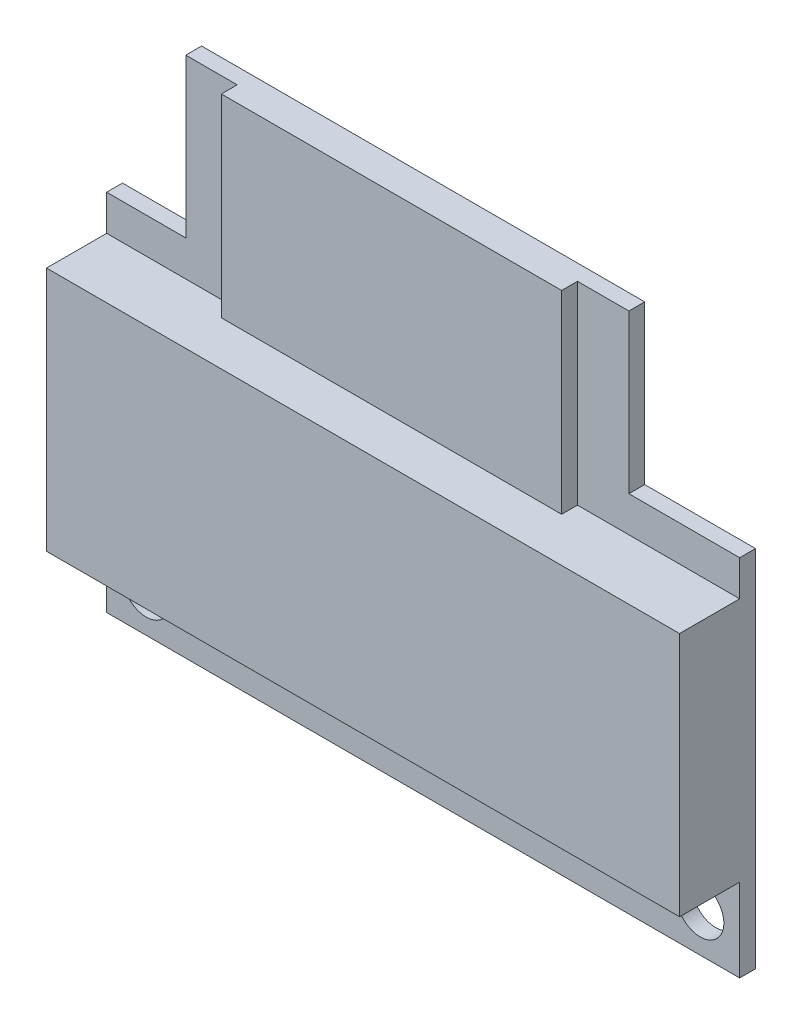
ISO-10303-21;
HEADER;
FILE_DESCRIPTION(('STEP AP214'),'2;1');
FILE_NAME('part.step','',(''),(''),'','','');
FILE_SCHEMA(('AUTOMOTIVE_DESIGN { 1 0 10303 214 1 1 1 1 }'));
ENDSEC;
DATA;
#1=APPLICATION_CONTEXT('core data for automotive mechanical design processes');
#2=APPLICATION_PROTOCOL_DEFINITION('international standard','automotive_design',2000,#1);
#3=PRODUCT_CONTEXT('',#1,'mechanical');
#4=PRODUCT('Part','Part','',(#3));
#5=PRODUCT_RELATED_PRODUCT_CATEGORY('part','',(#4));
#6=PRODUCT_DEFINITION_FORMATION('','',#4);
#7=PRODUCT_DEFINITION_CONTEXT('part definition',#1,'design');
#8=PRODUCT_DEFINITION('design','',#6,#7);
#9=PRODUCT_DEFINITION_SHAPE('','',#8);
#10=(LENGTH_UNIT() NAMED_UNIT(*) SI_UNIT(.MILLI.,.METRE.));
#11=(NAMED_UNIT(*) PLANE_ANGLE_UNIT() SI_UNIT($,.RADIAN.));
#12=(NAMED_UNIT(*) SI_UNIT($,.STERADIAN.) SOLID_ANGLE_UNIT());
#13=UNCERTAINTY_MEASURE_WITH_UNIT(LENGTH_MEASURE(1.E-05),#10,'distance_accuracy_value','');
#14=(GEOMETRIC_REPRESENTATION_CONTEXT(3) GLOBAL_UNCERTAINTY_ASSIGNED_CONTEXT((#13)) GLOBAL_UNIT_ASSIGNED_CONTEXT((#10,
#11,#12)) REPRESENTATION_CONTEXT('',''));
#15=CARTESIAN_POINT('',(0.,0.,0.));
#16=DIRECTION('',(0.,0.,1.));
#17=DIRECTION('',(1.,0.,0.));
#18=AXIS2_PLACEMENT_3D('',#15,#16,#17);
#19=CARTESIAN_POINT('',(0.,0.,2.));
#20=DIRECTION('',(0.,0.,-1.));
#21=DIRECTION('',(-1.,0.,0.));
#22=AXIS2_PLACEMENT_3D('',#19,#20,#21);
#23=PLANE('',#22);
#24=DIRECTION('',(-1.,0.,0.));
#25=VECTOR('',#24,1.);
#26=CARTESIAN_POINT('',(-88.2702560692639,13.0924856722247,2.));
#27=LINE('',#26,#25);
#28=CARTESIAN_POINT('',(-58.5202560692639,13.0924856722247,2.));
#29=VERTEX_POINT('',#28);
#30=CARTESIAN_POINT('',(-80.0202560692639,13.0924856722247,2.));
#31=VERTEX_POINT('',#30);
#32=EDGE_CURVE('E11',#29,#31,#27,.T.);
#33=ORIENTED_EDGE('',*,*,#32,.F.);
#34=DIRECTION('',(0.,1.,0.));
#35=VECTOR('',#34,1.);
#36=CARTESIAN_POINT('',(-58.5202560692639,25.3424856722248,2.));
#37=LINE('',#36,#35);
#38=CARTESIAN_POINT('',(-58.5202560692639,25.3424856722248,2.));
#39=VERTEX_POINT('',#38);
#40=EDGE_CURVE('E185',#29,#39,#37,.T.);
#41=ORIENTED_EDGE('',*,*,#40,.T.);
#42=DIRECTION('',(-1.,0.,0.));
#43=VECTOR('',#42,1.);
#44=CARTESIAN_POINT('',(-80.0202560692639,25.3424856722247,2.));
#45=LINE('',#44,#43);
#46=CARTESIAN_POINT('',(-80.0202560692639,25.3424856722247,2.));
#47=VERTEX_POINT('',#46);
#48=EDGE_CURVE('E183',#39,#47,#45,.T.);
#49=ORIENTED_EDGE('',*,*,#48,.T.);
#50=DIRECTION('',(0.,-1.,0.));
#51=VECTOR('',#50,1.);
#52=CARTESIAN_POINT('',(-80.0202560692639,13.0924856722247,2.));
#53=LINE('',#52,#51);
#54=EDGE_CURVE('E158',#47,#31,#53,.T.);
#55=ORIENTED_EDGE('',*,*,#54,.T.);
#56=EDGE_LOOP('',(#33,#41,#49,#55));
#57=FACE_BOUND('',#56,.T.);
#58=ADVANCED_FACE('F33',(#57),#23,.F.);
#59=CARTESIAN_POINT('',(0.,0.,1.));
#60=DIRECTION('',(0.,0.,-1.));
#61=DIRECTION('',(-1.,0.,0.));
#62=AXIS2_PLACEMENT_3D('',#59,#60,#61);
#63=PLANE('',#62);
#64=CARTESIAN_POINT('',(-50.7702560692639,-5.15751432777525,1.));
#65=DIRECTION('',(0.,0.,1.));
#66=DIRECTION('',(1.,0.,0.));
#67=AXIS2_PLACEMENT_3D('',#64,#65,#66);
#68=CIRCLE('',#67,1.5);
#69=CARTESIAN_POINT('',(-49.2702560692639,-5.15751432777525,1.));
#70=VERTEX_POINT('',#69);
#71=EDGE_CURVE('E407',#70,#70,#68,.T.);
#72=ORIENTED_EDGE('',*,*,#71,.F.);
#73=EDGE_LOOP('',(#72));
#74=FACE_BOUND('',#73,.T.);
#75=CARTESIAN_POINT('',(-85.7702560692639,-5.15751432777525,1.));
#76=DIRECTION('',(0.,0.,1.));
#77=DIRECTION('',(1.,0.,0.));
#78=AXIS2_PLACEMENT_3D('',#75,#76,#77);
#79=CIRCLE('',#78,1.5);
#80=CARTESIAN_POINT('',(-84.2702560692639,-5.15751432777525,1.));
#81=VERTEX_POINT('',#80);
#82=EDGE_CURVE('E177',#81,#81,#79,.T.);
#83=ORIENTED_EDGE('',*,*,#82,.F.);
#84=EDGE_LOOP('',(#83));
#85=FACE_BOUND('',#84,.T.);
#86=DIRECTION('',(1.,0.,0.));
#87=VECTOR('',#86,1.);
#88=CARTESIAN_POINT('',(-48.2702560692639,-2.40751432777526,1.));
#89=LINE('',#88,#87);
#90=CARTESIAN_POINT('',(-88.2702560692639,-2.40751432777526,1.));
#91=VERTEX_POINT('',#90);
#92=CARTESIAN_POINT('',(-48.2702560692639,-2.40751432777525,1.));
#93=VERTEX_POINT('',#92);
#94=EDGE_CURVE('E58',#91,#93,#89,.T.);
#95=ORIENTED_EDGE('',*,*,#94,.F.);
#96=DIRECTION('',(0.,-1.,0.));
#97=VECTOR('',#96,1.);
#98=CARTESIAN_POINT('',(-88.2702560692639,-7.65751432777526,1.));
#99=LINE('',#98,#97);
#100=CARTESIAN_POINT('',(-88.2702560692639,-7.65751432777526,1.));
#101=VERTEX_POINT('',#100);
#102=EDGE_CURVE('E155',#91,#101,#99,.T.);
#103=ORIENTED_EDGE('',*,*,#102,.T.);
#104=DIRECTION('',(1.,0.,0.));
#105=VECTOR('',#104,1.);
#106=CARTESIAN_POINT('',(-48.2702560692639,-7.65751432777526,1.));
#107=LINE('',#106,#105);
#108=CARTESIAN_POINT('',(-48.2702560692639,-7.65751432777526,1.));
#109=VERTEX_POINT('',#108);
#110=EDGE_CURVE('E203',#101,#109,#107,.T.);
#111=ORIENTED_EDGE('',*,*,#110,.T.);
#112=DIRECTION('',(0.,1.,0.));
#113=VECTOR('',#112,1.);
#114=CARTESIAN_POINT('',(-48.2702560692639,15.3424856722247,1.));
#115=LINE('',#114,#113);
#116=EDGE_CURVE('E216',#109,#93,#115,.T.);
#117=ORIENTED_EDGE('',*,*,#116,.T.);
#118=EDGE_LOOP('',(#95,#103,#111,#117));
#119=FACE_BOUND('',#118,.T.);
#120=ADVANCED_FACE('F349',(#74,#85,#119),#63,.F.);
#121=DIRECTION('',(-1.,0.,0.));
#122=VECTOR('',#121,1.);
#123=CARTESIAN_POINT('',(-88.2702560692639,13.0924856722247,1.));
#124=LINE('',#123,#122);
#125=CARTESIAN_POINT('',(-80.0202560692639,13.0924856722247,1.));
#126=VERTEX_POINT('',#125);
#127=CARTESIAN_POINT('',(-88.2702560692639,13.0924856722247,1.));
#128=VERTEX_POINT('',#127);
#129=EDGE_CURVE('E50',#126,#128,#124,.T.);
#130=ORIENTED_EDGE('',*,*,#129,.F.);
#131=DIRECTION('',(0.,-1.,0.));
#132=VECTOR('',#131,1.);
#133=CARTESIAN_POINT('',(-80.0202560692639,13.0924856722247,1.));
#134=LINE('',#133,#132);
#135=CARTESIAN_POINT('',(-80.0202560692639,25.3424856722247,1.));
#136=VERTEX_POINT('',#135);
#137=EDGE_CURVE('E199',#136,#126,#134,.T.);
#138=ORIENTED_EDGE('',*,*,#137,.F.);
#139=DIRECTION('',(-1.,0.,0.));
#140=VECTOR('',#139,1.);
#141=CARTESIAN_POINT('',(-83.2702560692639,25.3424856722247,1.));
#142=LINE('',#141,#140);
#143=CARTESIAN_POINT('',(-83.2702560692639,25.3424856722247,1.));
#144=VERTEX_POINT('',#143);
#145=EDGE_CURVE('E267',#136,#144,#142,.T.);
#146=ORIENTED_EDGE('',*,*,#145,.T.);
#147=DIRECTION('',(0.,-1.,0.));
#148=VECTOR('',#147,1.);
#149=CARTESIAN_POINT('',(-83.2702560692639,15.3424856722247,1.));
#150=LINE('',#149,#148);
#151=CARTESIAN_POINT('',(-83.2702560692639,15.3424856722247,1.));
#152=VERTEX_POINT('',#151);
#153=EDGE_CURVE('E272',#144,#152,#150,.T.);
#154=ORIENTED_EDGE('',*,*,#153,.T.);
#155=DIRECTION('',(-1.,0.,0.));
#156=VECTOR('',#155,1.);
#157=CARTESIAN_POINT('',(-88.2702560692639,15.3424856722247,1.));
#158=LINE('',#157,#156);
#159=CARTESIAN_POINT('',(-88.2702560692639,15.3424856722247,1.));
#160=VERTEX_POINT('',#159);
#161=EDGE_CURVE('E260',#152,#160,#158,.T.);
#162=ORIENTED_EDGE('',*,*,#161,.T.);
#163=EDGE_CURVE('E241',#160,#128,#99,.T.);
#164=ORIENTED_EDGE('',*,*,#163,.T.);
#165=EDGE_LOOP('',(#130,#138,#146,#154,#162,#164));
#166=FACE_BOUND('',#165,.T.);
#167=ADVANCED_FACE('F336',(#166),#63,.F.);
#168=DIRECTION('',(0.,1.,0.));
#169=VECTOR('',#168,1.);
#170=CARTESIAN_POINT('',(-58.5202560692639,25.3424856722248,1.));
#171=LINE('',#170,#169);
#172=CARTESIAN_POINT('',(-58.5202560692639,13.0924856722247,1.));
#173=VERTEX_POINT('',#172);
#174=CARTESIAN_POINT('',(-58.5202560692639,25.3424856722247,1.));
#175=VERTEX_POINT('',#174);
#176=EDGE_CURVE('E280',#173,#175,#171,.T.);
#177=ORIENTED_EDGE('',*,*,#176,.F.);
#178=DIRECTION('',(-1.,0.,0.));
#179=VECTOR('',#178,1.);
#180=CARTESIAN_POINT('',(-58.5202560692639,13.0924856722247,1.));
#181=LINE('',#180,#179);
#182=CARTESIAN_POINT('',(-48.2702560692639,13.0924856722247,1.));
#183=VERTEX_POINT('',#182);
#184=EDGE_CURVE('E192',#183,#173,#181,.T.);
#185=ORIENTED_EDGE('',*,*,#184,.F.);
#186=CARTESIAN_POINT('',(-48.2702560692639,15.3424856722247,1.));
#187=VERTEX_POINT('',#186);
#188=EDGE_CURVE('E206',#183,#187,#115,.T.);
#189=ORIENTED_EDGE('',*,*,#188,.T.);
#190=DIRECTION('',(-1.,0.,0.));
#191=VECTOR('',#190,1.);
#192=CARTESIAN_POINT('',(-55.2702560692639,15.3424856722247,1.));
#193=LINE('',#192,#191);
#194=CARTESIAN_POINT('',(-55.2702560692639,15.3424856722247,1.));
#195=VERTEX_POINT('',#194);
#196=EDGE_CURVE('E210',#187,#195,#193,.T.);
#197=ORIENTED_EDGE('',*,*,#196,.T.);
#198=DIRECTION('',(0.,1.,0.));
#199=VECTOR('',#198,1.);
#200=CARTESIAN_POINT('',(-55.2702560692639,25.3424856722247,1.));
#201=LINE('',#200,#199);
#202=CARTESIAN_POINT('',(-55.2702560692639,25.3424856722247,1.));
#203=VERTEX_POINT('',#202);
#204=EDGE_CURVE('E270',#195,#203,#201,.T.);
#205=ORIENTED_EDGE('',*,*,#204,.T.);
#206=EDGE_CURVE('E269',#203,#175,#142,.T.);
#207=ORIENTED_EDGE('',*,*,#206,.T.);
#208=EDGE_LOOP('',(#177,#185,#189,#197,#205,#207));
#209=FACE_BOUND('',#208,.T.);
#210=ADVANCED_FACE('F279',(#209),#63,.F.);
#211=CARTESIAN_POINT('',(-48.2702560692639,-7.65751432777526,1.));
#212=DIRECTION('',(0.,1.,0.));
#213=DIRECTION('',(0.,0.,1.));
#214=AXIS2_PLACEMENT_3D('',#211,#212,#213);
#215=PLANE('',#214);
#216=DIRECTION('',(1.,0.,0.));
#217=VECTOR('',#216,1.);
#218=CARTESIAN_POINT('',(-48.2702560692639,-7.65751432777526,0.));
#219=LINE('',#218,#217);
#220=CARTESIAN_POINT('',(-88.2702560692639,-7.65751432777526,0.));
#221=VERTEX_POINT('',#220);
#222=CARTESIAN_POINT('',(-48.2702560692639,-7.65751432777526,0.));
#223=VERTEX_POINT('',#222);
#224=EDGE_CURVE('E255',#221,#223,#219,.T.);
#225=ORIENTED_EDGE('',*,*,#224,.T.);
#226=DIRECTION('',(0.,0.,-1.));
#227=VECTOR('',#226,1.);
#228=CARTESIAN_POINT('',(-48.2702560692639,-7.65751432777526,1.));
#229=LINE('',#228,#227);
#230=EDGE_CURVE('E42',#109,#223,#229,.T.);
#231=ORIENTED_EDGE('',*,*,#230,.F.);
#232=ORIENTED_EDGE('',*,*,#110,.F.);
#233=DIRECTION('',(0.,0.,-1.));
#234=VECTOR('',#233,1.);
#235=CARTESIAN_POINT('',(-88.2702560692639,-7.65751432777526,1.));
#236=LINE('',#235,#234);
#237=EDGE_CURVE('E238',#101,#221,#236,.T.);
#238=ORIENTED_EDGE('',*,*,#237,.T.);
#239=EDGE_LOOP('',(#225,#231,#232,#238));
#240=FACE_BOUND('',#239,.T.);
#241=ADVANCED_FACE('F35',(#240),#215,.F.);
#242=CARTESIAN_POINT('',(-48.2702560692639,15.3424856722247,1.));
#243=DIRECTION('',(-1.,0.,0.));
#244=DIRECTION('',(0.,0.,1.));
#245=AXIS2_PLACEMENT_3D('',#242,#243,#244);
#246=PLANE('',#245);
#247=DIRECTION('',(0.,1.,0.));
#248=VECTOR('',#247,1.);
#249=CARTESIAN_POINT('',(-48.2702560692639,15.3424856722247,0.));
#250=LINE('',#249,#248);
#251=CARTESIAN_POINT('',(-48.2702560692639,15.3424856722247,0.));
#252=VERTEX_POINT('',#251);
#253=EDGE_CURVE('E253',#223,#252,#250,.T.);
#254=ORIENTED_EDGE('',*,*,#253,.T.);
#255=DIRECTION('',(0.,0.,-1.));
#256=VECTOR('',#255,1.);
#257=CARTESIAN_POINT('',(-48.2702560692639,15.3424856722247,1.));
#258=LINE('',#257,#256);
#259=EDGE_CURVE('E220',#187,#252,#258,.T.);
#260=ORIENTED_EDGE('',*,*,#259,.F.);
#261=ORIENTED_EDGE('',*,*,#188,.F.);
#262=DIRECTION('',(0.,0.,-1.));
#263=VECTOR('',#262,1.);
#264=CARTESIAN_POINT('',(-48.2702560692639,13.0924856722247,2.));
#265=LINE('',#264,#263);
#266=CARTESIAN_POINT('',(-48.2702560692639,13.0924856722247,4.8));
#267=VERTEX_POINT('',#266);
#268=EDGE_CURVE('E300',#267,#183,#265,.T.);
#269=ORIENTED_EDGE('',*,*,#268,.F.);
#270=DIRECTION('',(0.,1.,0.));
#271=VECTOR('',#270,1.);
#272=CARTESIAN_POINT('',(-48.2702560692639,13.0924856722247,4.8));
#273=LINE('',#272,#271);
#274=CARTESIAN_POINT('',(-48.2702560692639,-2.40751432777526,4.8));
#275=VERTEX_POINT('',#274);
#276=EDGE_CURVE('E168',#275,#267,#273,.T.);
#277=ORIENTED_EDGE('',*,*,#276,.F.);
#278=DIRECTION('',(0.,0.,-1.));
#279=VECTOR('',#278,1.);
#280=CARTESIAN_POINT('',(-48.2702560692639,-2.40751432777526,2.));
#281=LINE('',#280,#279);
#282=EDGE_CURVE('E164',#275,#93,#281,.T.);
#283=ORIENTED_EDGE('',*,*,#282,.T.);
#284=ORIENTED_EDGE('',*,*,#116,.F.);
#285=ORIENTED_EDGE('',*,*,#230,.T.);
#286=EDGE_LOOP('',(#254,#260,#261,#269,#277,#283,#284,#285));
#287=FACE_BOUND('',#286,.T.);
#288=ADVANCED_FACE('F332',(#287),#246,.F.);
#289=CARTESIAN_POINT('',(-55.2702560692639,15.3424856722247,1.));
#290=DIRECTION('',(0.,-1.,0.));
#291=DIRECTION('',(0.,0.,-1.));
#292=AXIS2_PLACEMENT_3D('',#289,#290,#291);
#293=PLANE('',#292);
#294=DIRECTION('',(-1.,0.,0.));
#295=VECTOR('',#294,1.);
#296=CARTESIAN_POINT('',(-55.2702560692639,15.3424856722247,0.));
#297=LINE('',#296,#295);
#298=CARTESIAN_POINT('',(-55.2702560692639,15.3424856722247,0.));
#299=VERTEX_POINT('',#298);
#300=EDGE_CURVE('E251',#252,#299,#297,.T.);
#301=ORIENTED_EDGE('',*,*,#300,.T.);
#302=DIRECTION('',(0.,0.,-1.));
#303=VECTOR('',#302,1.);
#304=CARTESIAN_POINT('',(-55.2702560692639,15.3424856722247,1.));
#305=LINE('',#304,#303);
#306=EDGE_CURVE('E223',#195,#299,#305,.T.);
#307=ORIENTED_EDGE('',*,*,#306,.F.);
#308=ORIENTED_EDGE('',*,*,#196,.F.);
#309=ORIENTED_EDGE('',*,*,#259,.T.);
#310=EDGE_LOOP('',(#301,#307,#308,#309));
#311=FACE_BOUND('',#310,.T.);
#312=ADVANCED_FACE('F369',(#311),#293,.F.);
#313=CARTESIAN_POINT('',(-55.2702560692639,25.3424856722247,1.));
#314=DIRECTION('',(-1.,0.,0.));
#315=DIRECTION('',(0.,0.,1.));
#316=AXIS2_PLACEMENT_3D('',#313,#314,#315);
#317=PLANE('',#316);
#318=DIRECTION('',(0.,1.,0.));
#319=VECTOR('',#318,1.);
#320=CARTESIAN_POINT('',(-55.2702560692639,25.3424856722247,0.));
#321=LINE('',#320,#319);
#322=CARTESIAN_POINT('',(-55.2702560692639,25.3424856722247,0.));
#323=VERTEX_POINT('',#322);
#324=EDGE_CURVE('E249',#299,#323,#321,.T.);
#325=ORIENTED_EDGE('',*,*,#324,.T.);
#326=DIRECTION('',(0.,0.,-1.));
#327=VECTOR('',#326,1.);
#328=CARTESIAN_POINT('',(-55.2702560692639,25.3424856722247,1.));
#329=LINE('',#328,#327);
#330=EDGE_CURVE('E226',#203,#323,#329,.T.);
#331=ORIENTED_EDGE('',*,*,#330,.F.);
#332=ORIENTED_EDGE('',*,*,#204,.F.);
#333=ORIENTED_EDGE('',*,*,#306,.T.);
#334=EDGE_LOOP('',(#325,#331,#332,#333));
#335=FACE_BOUND('',#334,.T.);
#336=ADVANCED_FACE('F373',(#335),#317,.F.);
#337=CARTESIAN_POINT('',(-83.2702560692639,25.3424856722247,1.));
#338=DIRECTION('',(0.,-1.,0.));
#339=DIRECTION('',(0.,0.,-1.));
#340=AXIS2_PLACEMENT_3D('',#337,#338,#339);
#341=PLANE('',#340);
#342=DIRECTION('',(-1.,0.,0.));
#343=VECTOR('',#342,1.);
#344=CARTESIAN_POINT('',(-83.2702560692639,25.3424856722247,0.));
#345=LINE('',#344,#343);
#346=CARTESIAN_POINT('',(-83.2702560692639,25.3424856722247,0.));
#347=VERTEX_POINT('',#346);
#348=EDGE_CURVE('E247',#323,#347,#345,.T.);
#349=ORIENTED_EDGE('',*,*,#348,.T.);
#350=DIRECTION('',(0.,0.,-1.));
#351=VECTOR('',#350,1.);
#352=CARTESIAN_POINT('',(-83.2702560692639,25.3424856722247,1.));
#353=LINE('',#352,#351);
#354=EDGE_CURVE('E229',#144,#347,#353,.T.);
#355=ORIENTED_EDGE('',*,*,#354,.F.);
#356=ORIENTED_EDGE('',*,*,#145,.F.);
#357=DIRECTION('',(0.,0.,-1.));
#358=VECTOR('',#357,1.);
#359=CARTESIAN_POINT('',(-80.0202560692639,25.3424856722247,2.));
#360=LINE('',#359,#358);
#361=EDGE_CURVE('E298',#47,#136,#360,.T.);
#362=ORIENTED_EDGE('',*,*,#361,.F.);
#363=ORIENTED_EDGE('',*,*,#48,.F.);
#364=DIRECTION('',(0.,0.,-1.));
#365=VECTOR('',#364,1.);
#366=CARTESIAN_POINT('',(-58.5202560692639,25.3424856722248,2.));
#367=LINE('',#366,#365);
#368=EDGE_CURVE('E291',#39,#175,#367,.T.);
#369=ORIENTED_EDGE('',*,*,#368,.T.);
#370=ORIENTED_EDGE('',*,*,#206,.F.);
#371=ORIENTED_EDGE('',*,*,#330,.T.);
#372=EDGE_LOOP('',(#349,#355,#356,#362,#363,#369,#370,#371));
#373=FACE_BOUND('',#372,.T.);
#374=ADVANCED_FACE('F296',(#373),#341,.F.);
#375=CARTESIAN_POINT('',(-83.2702560692639,15.3424856722247,1.));
#376=DIRECTION('',(1.,0.,0.));
#377=DIRECTION('',(0.,0.,-1.));
#378=AXIS2_PLACEMENT_3D('',#375,#376,#377);
#379=PLANE('',#378);
#380=DIRECTION('',(0.,-1.,0.));
#381=VECTOR('',#380,1.);
#382=CARTESIAN_POINT('',(-83.2702560692639,15.3424856722247,0.));
#383=LINE('',#382,#381);
#384=CARTESIAN_POINT('',(-83.2702560692639,15.3424856722247,0.));
#385=VERTEX_POINT('',#384);
#386=EDGE_CURVE('E245',#347,#385,#383,.T.);
#387=ORIENTED_EDGE('',*,*,#386,.T.);
#388=DIRECTION('',(0.,0.,-1.));
#389=VECTOR('',#388,1.);
#390=CARTESIAN_POINT('',(-83.2702560692639,15.3424856722247,1.));
#391=LINE('',#390,#389);
#392=EDGE_CURVE('E232',#152,#385,#391,.T.);
#393=ORIENTED_EDGE('',*,*,#392,.F.);
#394=ORIENTED_EDGE('',*,*,#153,.F.);
#395=ORIENTED_EDGE('',*,*,#354,.T.);
#396=EDGE_LOOP('',(#387,#393,#394,#395));
#397=FACE_BOUND('',#396,.T.);
#398=ADVANCED_FACE('F382',(#397),#379,.F.);
#399=CARTESIAN_POINT('',(-88.2702560692639,15.3424856722247,1.));
#400=DIRECTION('',(0.,-1.,0.));
#401=DIRECTION('',(0.,0.,-1.));
#402=AXIS2_PLACEMENT_3D('',#399,#400,#401);
#403=PLANE('',#402);
#404=DIRECTION('',(-1.,0.,0.));
#405=VECTOR('',#404,1.);
#406=CARTESIAN_POINT('',(-88.2702560692639,15.3424856722247,0.));
#407=LINE('',#406,#405);
#408=CARTESIAN_POINT('',(-88.2702560692639,15.3424856722247,0.));
#409=VERTEX_POINT('',#408);
#410=EDGE_CURVE('E243',#385,#409,#407,.T.);
#411=ORIENTED_EDGE('',*,*,#410,.T.);
#412=DIRECTION('',(0.,0.,-1.));
#413=VECTOR('',#412,1.);
#414=CARTESIAN_POINT('',(-88.2702560692639,15.3424856722247,1.));
#415=LINE('',#414,#413);
#416=EDGE_CURVE('E235',#160,#409,#415,.T.);
#417=ORIENTED_EDGE('',*,*,#416,.F.);
#418=ORIENTED_EDGE('',*,*,#161,.F.);
#419=ORIENTED_EDGE('',*,*,#392,.T.);
#420=EDGE_LOOP('',(#411,#417,#418,#419));
#421=FACE_BOUND('',#420,.T.);
#422=ADVANCED_FACE('F339',(#421),#403,.F.);
#423=CARTESIAN_POINT('',(-88.2702560692639,-7.65751432777526,1.));
#424=DIRECTION('',(1.,0.,0.));
#425=DIRECTION('',(0.,0.,-1.));
#426=AXIS2_PLACEMENT_3D('',#423,#424,#425);
#427=PLANE('',#426);
#428=DIRECTION('',(0.,-1.,0.));
#429=VECTOR('',#428,1.);
#430=CARTESIAN_POINT('',(-88.2702560692639,-7.65751432777526,0.));
#431=LINE('',#430,#429);
#432=EDGE_CURVE('E207',#409,#221,#431,.T.);
#433=ORIENTED_EDGE('',*,*,#432,.T.);
#434=ORIENTED_EDGE('',*,*,#237,.F.);
#435=ORIENTED_EDGE('',*,*,#102,.F.);
#436=DIRECTION('',(0.,0.,-1.));
#437=VECTOR('',#436,1.);
#438=CARTESIAN_POINT('',(-88.2702560692639,-2.40751432777526,2.));
#439=LINE('',#438,#437);
#440=CARTESIAN_POINT('',(-88.2702560692639,-2.40751432777526,4.8));
#441=VERTEX_POINT('',#440);
#442=EDGE_CURVE('E148',#441,#91,#439,.T.);
#443=ORIENTED_EDGE('',*,*,#442,.F.);
#444=DIRECTION('',(0.,-1.,0.));
#445=VECTOR('',#444,1.);
#446=CARTESIAN_POINT('',(-88.2702560692639,13.0924856722247,4.8));
#447=LINE('',#446,#445);
#448=CARTESIAN_POINT('',(-88.2702560692639,13.0924856722247,4.8));
#449=VERTEX_POINT('',#448);
#450=EDGE_CURVE('E153',#449,#441,#447,.T.);
#451=ORIENTED_EDGE('',*,*,#450,.F.);
#452=DIRECTION('',(0.,0.,-1.));
#453=VECTOR('',#452,1.);
#454=CARTESIAN_POINT('',(-88.2702560692639,13.0924856722247,2.));
#455=LINE('',#454,#453);
#456=EDGE_CURVE('E157',#449,#128,#455,.T.);
#457=ORIENTED_EDGE('',*,*,#456,.T.);
#458=ORIENTED_EDGE('',*,*,#163,.F.);
#459=ORIENTED_EDGE('',*,*,#416,.T.);
#460=EDGE_LOOP('',(#433,#434,#435,#443,#451,#457,#458,#459));
#461=FACE_BOUND('',#460,.T.);
#462=ADVANCED_FACE('F150',(#461),#427,.F.);
#463=CARTESIAN_POINT('',(0.,0.,0.));
#464=DIRECTION('',(0.,0.,-1.));
#465=DIRECTION('',(-1.,0.,0.));
#466=AXIS2_PLACEMENT_3D('',#463,#464,#465);
#467=PLANE('',#466);
#468=CARTESIAN_POINT('',(-50.7702560692639,-5.15751432777525,0.));
#469=DIRECTION('',(0.,0.,1.));
#470=DIRECTION('',(1.,0.,0.));
#471=AXIS2_PLACEMENT_3D('',#468,#469,#470);
#472=CIRCLE('',#471,1.5);
#473=CARTESIAN_POINT('',(-49.2702560692639,-5.15751432777525,0.));
#474=VERTEX_POINT('',#473);
#475=EDGE_CURVE('E397',#474,#474,#472,.T.);
#476=ORIENTED_EDGE('',*,*,#475,.T.);
#477=EDGE_LOOP('',(#476));
#478=FACE_BOUND('',#477,.T.);
#479=CARTESIAN_POINT('',(-85.7702560692639,-5.15751432777525,0.));
#480=DIRECTION('',(0.,0.,1.));
#481=DIRECTION('',(1.,0.,0.));
#482=AXIS2_PLACEMENT_3D('',#479,#480,#481);
#483=CIRCLE('',#482,1.5);
#484=CARTESIAN_POINT('',(-84.2702560692639,-5.15751432777525,0.));
#485=VERTEX_POINT('',#484);
#486=EDGE_CURVE('E174',#485,#485,#483,.T.);
#487=ORIENTED_EDGE('',*,*,#486,.T.);
#488=EDGE_LOOP('',(#487));
#489=FACE_BOUND('',#488,.T.);
#490=ORIENTED_EDGE('',*,*,#224,.F.);
#491=ORIENTED_EDGE('',*,*,#432,.F.);
#492=ORIENTED_EDGE('',*,*,#410,.F.);
#493=ORIENTED_EDGE('',*,*,#386,.F.);
#494=ORIENTED_EDGE('',*,*,#348,.F.);
#495=ORIENTED_EDGE('',*,*,#324,.F.);
#496=ORIENTED_EDGE('',*,*,#300,.F.);
#497=ORIENTED_EDGE('',*,*,#253,.F.);
#498=EDGE_LOOP('',(#490,#491,#492,#493,#494,#495,#496,#497));
#499=FACE_BOUND('',#498,.T.);
#500=ADVANCED_FACE('F344',(#478,#489,#499),#467,.T.);
#501=CARTESIAN_POINT('',(-48.2702560692639,-2.40751432777526,2.));
#502=DIRECTION('',(0.,1.,0.));
#503=DIRECTION('',(0.,0.,1.));
#504=AXIS2_PLACEMENT_3D('',#501,#502,#503);
#505=PLANE('',#504);
#506=ORIENTED_EDGE('',*,*,#94,.T.);
#507=ORIENTED_EDGE('',*,*,#282,.F.);
#508=DIRECTION('',(1.,0.,0.));
#509=VECTOR('',#508,1.);
#510=CARTESIAN_POINT('',(-88.2702560692639,-2.40751432777526,4.8));
#511=LINE('',#510,#509);
#512=EDGE_CURVE('E161',#441,#275,#511,.T.);
#513=ORIENTED_EDGE('',*,*,#512,.F.);
#514=ORIENTED_EDGE('',*,*,#442,.T.);
#515=EDGE_LOOP('',(#506,#507,#513,#514));
#516=FACE_BOUND('',#515,.T.);
#517=ADVANCED_FACE('F162',(#516),#505,.F.);
#518=CARTESIAN_POINT('',(-58.5202560692639,13.0924856722247,2.));
#519=DIRECTION('',(0.,-1.,0.));
#520=DIRECTION('',(0.,0.,-1.));
#521=AXIS2_PLACEMENT_3D('',#518,#519,#520);
#522=PLANE('',#521);
#523=ORIENTED_EDGE('',*,*,#184,.T.);
#524=DIRECTION('',(0.,0.,-1.));
#525=VECTOR('',#524,1.);
#526=CARTESIAN_POINT('',(-58.5202560692639,13.0924856722247,2.));
#527=LINE('',#526,#525);
#528=EDGE_CURVE('E294',#29,#173,#527,.T.);
#529=ORIENTED_EDGE('',*,*,#528,.F.);
#530=ORIENTED_EDGE('',*,*,#32,.T.);
#531=DIRECTION('',(0.,0.,-1.));
#532=VECTOR('',#531,1.);
#533=CARTESIAN_POINT('',(-80.0202560692639,13.0924856722247,2.));
#534=LINE('',#533,#532);
#535=EDGE_CURVE('E303',#31,#126,#534,.T.);
#536=ORIENTED_EDGE('',*,*,#535,.T.);
#537=ORIENTED_EDGE('',*,*,#129,.T.);
#538=ORIENTED_EDGE('',*,*,#456,.F.);
#539=DIRECTION('',(-1.,0.,0.));
#540=VECTOR('',#539,1.);
#541=CARTESIAN_POINT('',(-88.2702560692639,13.0924856722247,4.8));
#542=LINE('',#541,#540);
#543=EDGE_CURVE('E173',#267,#449,#542,.T.);
#544=ORIENTED_EDGE('',*,*,#543,.F.);
#545=ORIENTED_EDGE('',*,*,#268,.T.);
#546=EDGE_LOOP('',(#523,#529,#530,#536,#537,#538,#544,#545));
#547=FACE_BOUND('',#546,.T.);
#548=ADVANCED_FACE('F323',(#547),#522,.F.);
#549=CARTESIAN_POINT('',(-58.5202560692639,25.3424856722248,2.));
#550=DIRECTION('',(-1.,0.,0.));
#551=DIRECTION('',(0.,0.,1.));
#552=AXIS2_PLACEMENT_3D('',#549,#550,#551);
#553=PLANE('',#552);
#554=ORIENTED_EDGE('',*,*,#176,.T.);
#555=ORIENTED_EDGE('',*,*,#368,.F.);
#556=ORIENTED_EDGE('',*,*,#40,.F.);
#557=ORIENTED_EDGE('',*,*,#528,.T.);
#558=EDGE_LOOP('',(#554,#555,#556,#557));
#559=FACE_BOUND('',#558,.T.);
#560=ADVANCED_FACE('F289',(#559),#553,.F.);
#561=CARTESIAN_POINT('',(-80.0202560692639,13.0924856722247,2.));
#562=DIRECTION('',(1.,0.,0.));
#563=DIRECTION('',(0.,0.,-1.));
#564=AXIS2_PLACEMENT_3D('',#561,#562,#563);
#565=PLANE('',#564);
#566=ORIENTED_EDGE('',*,*,#137,.T.);
#567=ORIENTED_EDGE('',*,*,#535,.F.);
#568=ORIENTED_EDGE('',*,*,#54,.F.);
#569=ORIENTED_EDGE('',*,*,#361,.T.);
#570=EDGE_LOOP('',(#566,#567,#568,#569));
#571=FACE_BOUND('',#570,.T.);
#572=ADVANCED_FACE('F419',(#571),#565,.F.);
#573=CARTESIAN_POINT('',(0.,0.,4.8));
#574=DIRECTION('',(0.,0.,1.));
#575=DIRECTION('',(1.,0.,0.));
#576=AXIS2_PLACEMENT_3D('',#573,#574,#575);
#577=PLANE('',#576);
#578=ORIENTED_EDGE('',*,*,#450,.T.);
#579=ORIENTED_EDGE('',*,*,#512,.T.);
#580=ORIENTED_EDGE('',*,*,#276,.T.);
#581=ORIENTED_EDGE('',*,*,#543,.T.);
#582=EDGE_LOOP('',(#578,#579,#580,#581));
#583=FACE_BOUND('',#582,.T.);
#584=ADVANCED_FACE('F171',(#583),#577,.T.);
#585=CARTESIAN_POINT('',(-85.7702560692639,-5.15751432777525,0.));
#586=DIRECTION('',(0.,0.,1.));
#587=DIRECTION('',(1.,0.,0.));
#588=AXIS2_PLACEMENT_3D('',#585,#586,#587);
#589=CYLINDRICAL_SURFACE('',#588,1.5);
#590=ORIENTED_EDGE('',*,*,#486,.F.);
#591=EDGE_LOOP('',(#590));
#592=FACE_BOUND('',#591,.T.);
#593=ORIENTED_EDGE('',*,*,#82,.T.);
#594=EDGE_LOOP('',(#593));
#595=FACE_BOUND('',#594,.T.);
#596=ADVANCED_FACE('F400',(#592,#595),#589,.F.);
#597=CARTESIAN_POINT('',(-50.7702560692639,-5.15751432777525,0.));
#598=DIRECTION('',(0.,0.,1.));
#599=DIRECTION('',(1.,0.,0.));
#600=AXIS2_PLACEMENT_3D('',#597,#598,#599);
#601=CYLINDRICAL_SURFACE('',#600,1.5);
#602=ORIENTED_EDGE('',*,*,#475,.F.);
#603=EDGE_LOOP('',(#602));
#604=FACE_BOUND('',#603,.T.);
#605=ORIENTED_EDGE('',*,*,#71,.T.);
#606=EDGE_LOOP('',(#605));
#607=FACE_BOUND('',#606,.T.);
#608=ADVANCED_FACE('F403',(#604,#607),#601,.F.);
#609=CLOSED_SHELL('',(#58,#120,#167,#210,#241,#288,#312,#336,#374,#398,#422,#462,#500,#517,#548,
#560,#572,#584,#596,#608));
#610=MANIFOLD_SOLID_BREP('B2',#609);
#611=ADVANCED_BREP_SHAPE_REPRESENTATION('',(#18,#610),#14);
#612=SHAPE_DEFINITION_REPRESENTATION(#9,#611);
ENDSEC;
END-ISO-10303-21;
